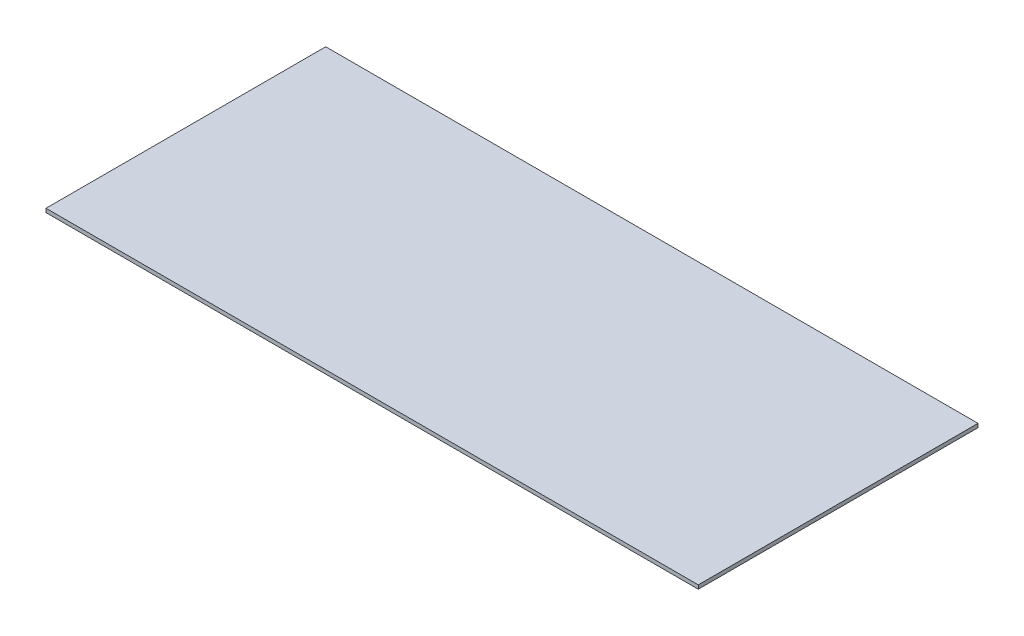
ISO-10303-21;
HEADER;
FILE_DESCRIPTION(('STEP AP214'),'2;1');
FILE_NAME('part.step','',(''),(''),'','','');
FILE_SCHEMA(('AUTOMOTIVE_DESIGN { 1 0 10303 214 1 1 1 1 }'));
ENDSEC;
DATA;
#1=APPLICATION_CONTEXT('core data for automotive mechanical design processes');
#2=APPLICATION_PROTOCOL_DEFINITION('international standard','automotive_design',2000,#1);
#3=PRODUCT_CONTEXT('',#1,'mechanical');
#4=PRODUCT('Part','Part','',(#3));
#5=PRODUCT_RELATED_PRODUCT_CATEGORY('part','',(#4));
#6=PRODUCT_DEFINITION_FORMATION('','',#4);
#7=PRODUCT_DEFINITION_CONTEXT('part definition',#1,'design');
#8=PRODUCT_DEFINITION('design','',#6,#7);
#9=PRODUCT_DEFINITION_SHAPE('','',#8);
#10=(LENGTH_UNIT() NAMED_UNIT(*) SI_UNIT(.MILLI.,.METRE.));
#11=(NAMED_UNIT(*) PLANE_ANGLE_UNIT() SI_UNIT($,.RADIAN.));
#12=(NAMED_UNIT(*) SI_UNIT($,.STERADIAN.) SOLID_ANGLE_UNIT());
#13=UNCERTAINTY_MEASURE_WITH_UNIT(LENGTH_MEASURE(1.E-05),#10,'distance_accuracy_value','');
#14=(GEOMETRIC_REPRESENTATION_CONTEXT(3) GLOBAL_UNCERTAINTY_ASSIGNED_CONTEXT((#13)) GLOBAL_UNIT_ASSIGNED_CONTEXT((#10,
#11,#12)) REPRESENTATION_CONTEXT('',''));
#15=CARTESIAN_POINT('',(0.,0.,0.));
#16=DIRECTION('',(0.,0.,1.));
#17=DIRECTION('',(1.,0.,0.));
#18=AXIS2_PLACEMENT_3D('',#15,#16,#17);
#19=CARTESIAN_POINT('',(192.15,2.24376260360046,-82.4));
#20=DIRECTION('',(-1.,0.,0.));
#21=DIRECTION('',(0.,0.,1.));
#22=AXIS2_PLACEMENT_3D('',#19,#20,#21);
#23=PLANE('',#22);
#24=DIRECTION('',(0.,0.,-1.));
#25=VECTOR('',#24,1.);
#26=CARTESIAN_POINT('',(192.15,0.,-82.4));
#27=LINE('',#26,#25);
#28=CARTESIAN_POINT('',(192.15,0.,82.4));
#29=VERTEX_POINT('',#28);
#30=CARTESIAN_POINT('',(192.15,0.,-82.4));
#31=VERTEX_POINT('',#30);
#32=EDGE_CURVE('E111',#29,#31,#27,.T.);
#33=ORIENTED_EDGE('',*,*,#32,.T.);
#34=DIRECTION('',(0.,-1.,0.));
#35=VECTOR('',#34,1.);
#36=CARTESIAN_POINT('',(192.15,2.24376260360046,-82.4));
#37=LINE('',#36,#35);
#38=CARTESIAN_POINT('',(192.15,2.24376260360046,-82.4));
#39=VERTEX_POINT('',#38);
#40=EDGE_CURVE('E11',#39,#31,#37,.T.);
#41=ORIENTED_EDGE('',*,*,#40,.F.);
#42=DIRECTION('',(0.,0.,-1.));
#43=VECTOR('',#42,1.);
#44=CARTESIAN_POINT('',(192.15,2.24376260360046,-82.4));
#45=LINE('',#44,#43);
#46=CARTESIAN_POINT('',(192.15,2.24376260360046,82.4));
#47=VERTEX_POINT('',#46);
#48=EDGE_CURVE('E95',#47,#39,#45,.T.);
#49=ORIENTED_EDGE('',*,*,#48,.F.);
#50=DIRECTION('',(0.,-1.,0.));
#51=VECTOR('',#50,1.);
#52=CARTESIAN_POINT('',(192.15,2.24376260360046,82.4));
#53=LINE('',#52,#51);
#54=EDGE_CURVE('E107',#47,#29,#53,.T.);
#55=ORIENTED_EDGE('',*,*,#54,.T.);
#56=EDGE_LOOP('',(#33,#41,#49,#55));
#57=FACE_BOUND('',#56,.T.);
#58=ADVANCED_FACE('F43',(#57),#23,.F.);
#59=CARTESIAN_POINT('',(-192.15,2.24376260360046,-82.4));
#60=DIRECTION('',(0.,0.,1.));
#61=DIRECTION('',(1.,0.,0.));
#62=AXIS2_PLACEMENT_3D('',#59,#60,#61);
#63=PLANE('',#62);
#64=DIRECTION('',(-1.,0.,0.));
#65=VECTOR('',#64,1.);
#66=CARTESIAN_POINT('',(-192.15,0.,-82.4));
#67=LINE('',#66,#65);
#68=CARTESIAN_POINT('',(-192.15,0.,-82.4));
#69=VERTEX_POINT('',#68);
#70=EDGE_CURVE('E100',#31,#69,#67,.T.);
#71=ORIENTED_EDGE('',*,*,#70,.T.);
#72=DIRECTION('',(0.,-1.,0.));
#73=VECTOR('',#72,1.);
#74=CARTESIAN_POINT('',(-192.15,2.24376260360046,-82.4));
#75=LINE('',#74,#73);
#76=CARTESIAN_POINT('',(-192.15,2.24376260360046,-82.4));
#77=VERTEX_POINT('',#76);
#78=EDGE_CURVE('E52',#77,#69,#75,.T.);
#79=ORIENTED_EDGE('',*,*,#78,.F.);
#80=DIRECTION('',(-1.,0.,0.));
#81=VECTOR('',#80,1.);
#82=CARTESIAN_POINT('',(-192.15,2.24376260360046,-82.4));
#83=LINE('',#82,#81);
#84=EDGE_CURVE('E90',#39,#77,#83,.T.);
#85=ORIENTED_EDGE('',*,*,#84,.F.);
#86=ORIENTED_EDGE('',*,*,#40,.T.);
#87=EDGE_LOOP('',(#71,#79,#85,#86));
#88=FACE_BOUND('',#87,.T.);
#89=ADVANCED_FACE('F99',(#88),#63,.F.);
#90=CARTESIAN_POINT('',(-192.15,2.24376260360046,-82.4));
#91=DIRECTION('',(1.,0.,0.));
#92=DIRECTION('',(0.,0.,-1.));
#93=AXIS2_PLACEMENT_3D('',#90,#91,#92);
#94=PLANE('',#93);
#95=DIRECTION('',(0.,0.,1.));
#96=VECTOR('',#95,1.);
#97=CARTESIAN_POINT('',(-192.15,0.,-82.4));
#98=LINE('',#97,#96);
#99=CARTESIAN_POINT('',(-192.15,0.,82.4));
#100=VERTEX_POINT('',#99);
#101=EDGE_CURVE('E77',#69,#100,#98,.T.);
#102=ORIENTED_EDGE('',*,*,#101,.T.);
#103=DIRECTION('',(0.,-1.,0.));
#104=VECTOR('',#103,1.);
#105=CARTESIAN_POINT('',(-192.15,2.24376260360046,82.4));
#106=LINE('',#105,#104);
#107=CARTESIAN_POINT('',(-192.15,2.24376260360046,82.4));
#108=VERTEX_POINT('',#107);
#109=EDGE_CURVE('E102',#108,#100,#106,.T.);
#110=ORIENTED_EDGE('',*,*,#109,.F.);
#111=DIRECTION('',(0.,0.,1.));
#112=VECTOR('',#111,1.);
#113=CARTESIAN_POINT('',(-192.15,2.24376260360046,-82.4));
#114=LINE('',#113,#112);
#115=EDGE_CURVE('E93',#77,#108,#114,.T.);
#116=ORIENTED_EDGE('',*,*,#115,.F.);
#117=ORIENTED_EDGE('',*,*,#78,.T.);
#118=EDGE_LOOP('',(#102,#110,#116,#117));
#119=FACE_BOUND('',#118,.T.);
#120=ADVANCED_FACE('F103',(#119),#94,.F.);
#121=CARTESIAN_POINT('',(-192.15,2.24376260360046,82.4));
#122=DIRECTION('',(0.,0.,-1.));
#123=DIRECTION('',(-1.,0.,0.));
#124=AXIS2_PLACEMENT_3D('',#121,#122,#123);
#125=PLANE('',#124);
#126=DIRECTION('',(1.,0.,0.));
#127=VECTOR('',#126,1.);
#128=CARTESIAN_POINT('',(-192.15,0.,82.4));
#129=LINE('',#128,#127);
#130=EDGE_CURVE('E83',#100,#29,#129,.T.);
#131=ORIENTED_EDGE('',*,*,#130,.T.);
#132=ORIENTED_EDGE('',*,*,#54,.F.);
#133=DIRECTION('',(1.,0.,0.));
#134=VECTOR('',#133,1.);
#135=CARTESIAN_POINT('',(-192.15,2.24376260360046,82.4));
#136=LINE('',#135,#134);
#137=EDGE_CURVE('E60',#108,#47,#136,.T.);
#138=ORIENTED_EDGE('',*,*,#137,.F.);
#139=ORIENTED_EDGE('',*,*,#109,.T.);
#140=EDGE_LOOP('',(#131,#132,#138,#139));
#141=FACE_BOUND('',#140,.T.);
#142=ADVANCED_FACE('F124',(#141),#125,.F.);
#143=CARTESIAN_POINT('',(0.,2.24376260360046,0.));
#144=DIRECTION('',(0.,1.,0.));
#145=DIRECTION('',(0.,0.,1.));
#146=AXIS2_PLACEMENT_3D('',#143,#144,#145);
#147=PLANE('',#146);
#148=ORIENTED_EDGE('',*,*,#48,.T.);
#149=ORIENTED_EDGE('',*,*,#84,.T.);
#150=ORIENTED_EDGE('',*,*,#115,.T.);
#151=ORIENTED_EDGE('',*,*,#137,.T.);
#152=EDGE_LOOP('',(#148,#149,#150,#151));
#153=FACE_BOUND('',#152,.T.);
#154=ADVANCED_FACE('F91',(#153),#147,.T.);
#155=CARTESIAN_POINT('',(0.,0.,0.));
#156=DIRECTION('',(0.,1.,0.));
#157=DIRECTION('',(0.,0.,1.));
#158=AXIS2_PLACEMENT_3D('',#155,#156,#157);
#159=PLANE('',#158);
#160=ORIENTED_EDGE('',*,*,#32,.F.);
#161=ORIENTED_EDGE('',*,*,#130,.F.);
#162=ORIENTED_EDGE('',*,*,#101,.F.);
#163=ORIENTED_EDGE('',*,*,#70,.F.);
#164=EDGE_LOOP('',(#160,#161,#162,#163));
#165=FACE_BOUND('',#164,.T.);
#166=ADVANCED_FACE('F127',(#165),#159,.F.);
#167=CLOSED_SHELL('',(#58,#89,#120,#142,#154,#166));
#168=MANIFOLD_SOLID_BREP('B2',#167);
#169=ADVANCED_BREP_SHAPE_REPRESENTATION('',(#18,#168),#14);
#170=SHAPE_DEFINITION_REPRESENTATION(#9,#169);
ENDSEC;
END-ISO-10303-21;
